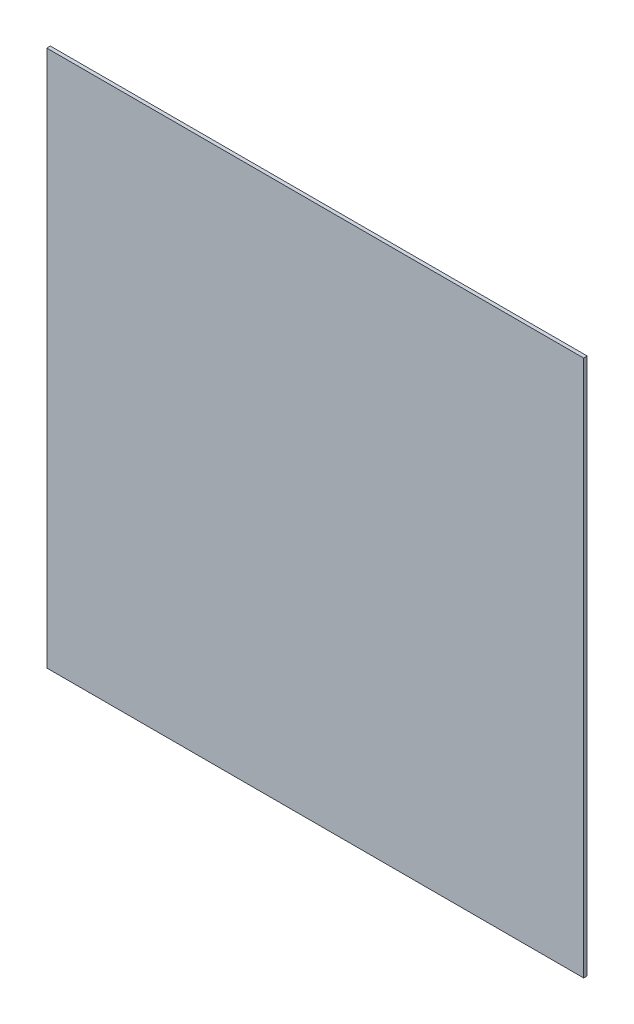
ISO-10303-21;
HEADER;
FILE_DESCRIPTION(('STEP AP214'),'2;1');
FILE_NAME('part.step','',(''),(''),'','','');
FILE_SCHEMA(('AUTOMOTIVE_DESIGN { 1 0 10303 214 1 1 1 1 }'));
ENDSEC;
DATA;
#1=APPLICATION_CONTEXT('core data for automotive mechanical design processes');
#2=APPLICATION_PROTOCOL_DEFINITION('international standard','automotive_design',2000,#1);
#3=PRODUCT_CONTEXT('',#1,'mechanical');
#4=PRODUCT('Part','Part','',(#3));
#5=PRODUCT_RELATED_PRODUCT_CATEGORY('part','',(#4));
#6=PRODUCT_DEFINITION_FORMATION('','',#4);
#7=PRODUCT_DEFINITION_CONTEXT('part definition',#1,'design');
#8=PRODUCT_DEFINITION('design','',#6,#7);
#9=PRODUCT_DEFINITION_SHAPE('','',#8);
#10=(LENGTH_UNIT() NAMED_UNIT(*) SI_UNIT(.MILLI.,.METRE.));
#11=(NAMED_UNIT(*) PLANE_ANGLE_UNIT() SI_UNIT($,.RADIAN.));
#12=(NAMED_UNIT(*) SI_UNIT($,.STERADIAN.) SOLID_ANGLE_UNIT());
#13=UNCERTAINTY_MEASURE_WITH_UNIT(LENGTH_MEASURE(1.E-05),#10,'distance_accuracy_value','');
#14=(GEOMETRIC_REPRESENTATION_CONTEXT(3) GLOBAL_UNCERTAINTY_ASSIGNED_CONTEXT((#13)) GLOBAL_UNIT_ASSIGNED_CONTEXT((#10,
#11,#12)) REPRESENTATION_CONTEXT('',''));
#15=CARTESIAN_POINT('',(0.,0.,0.));
#16=DIRECTION('',(0.,0.,1.));
#17=DIRECTION('',(1.,0.,0.));
#18=AXIS2_PLACEMENT_3D('',#15,#16,#17);
#19=CARTESIAN_POINT('',(0.,0.,3.));
#20=DIRECTION('',(1.,0.,0.));
#21=DIRECTION('',(0.,0.,-1.));
#22=AXIS2_PLACEMENT_3D('',#19,#20,#21);
#23=PLANE('',#22);
#24=DIRECTION('',(0.,-1.,0.));
#25=VECTOR('',#24,1.);
#26=CARTESIAN_POINT('',(0.,0.,0.));
#27=LINE('',#26,#25);
#28=CARTESIAN_POINT('',(0.,450.,0.));
#29=VERTEX_POINT('',#28);
#30=CARTESIAN_POINT('',(0.,0.,0.));
#31=VERTEX_POINT('',#30);
#32=EDGE_CURVE('E111',#29,#31,#27,.T.);
#33=ORIENTED_EDGE('',*,*,#32,.T.);
#34=DIRECTION('',(0.,0.,-1.));
#35=VECTOR('',#34,1.);
#36=CARTESIAN_POINT('',(0.,0.,3.));
#37=LINE('',#36,#35);
#38=CARTESIAN_POINT('',(0.,0.,3.));
#39=VERTEX_POINT('',#38);
#40=EDGE_CURVE('E11',#39,#31,#37,.T.);
#41=ORIENTED_EDGE('',*,*,#40,.F.);
#42=DIRECTION('',(0.,-1.,0.));
#43=VECTOR('',#42,1.);
#44=CARTESIAN_POINT('',(0.,0.,3.));
#45=LINE('',#44,#43);
#46=CARTESIAN_POINT('',(0.,450.,3.));
#47=VERTEX_POINT('',#46);
#48=EDGE_CURVE('E95',#47,#39,#45,.T.);
#49=ORIENTED_EDGE('',*,*,#48,.F.);
#50=DIRECTION('',(0.,0.,-1.));
#51=VECTOR('',#50,1.);
#52=CARTESIAN_POINT('',(0.,450.,3.));
#53=LINE('',#52,#51);
#54=EDGE_CURVE('E107',#47,#29,#53,.T.);
#55=ORIENTED_EDGE('',*,*,#54,.T.);
#56=EDGE_LOOP('',(#33,#41,#49,#55));
#57=FACE_BOUND('',#56,.T.);
#58=ADVANCED_FACE('F43',(#57),#23,.F.);
#59=CARTESIAN_POINT('',(0.,0.,3.));
#60=DIRECTION('',(0.,1.,0.));
#61=DIRECTION('',(0.,0.,1.));
#62=AXIS2_PLACEMENT_3D('',#59,#60,#61);
#63=PLANE('',#62);
#64=DIRECTION('',(1.,0.,0.));
#65=VECTOR('',#64,1.);
#66=CARTESIAN_POINT('',(0.,0.,0.));
#67=LINE('',#66,#65);
#68=CARTESIAN_POINT('',(450.,0.,0.));
#69=VERTEX_POINT('',#68);
#70=EDGE_CURVE('E100',#31,#69,#67,.T.);
#71=ORIENTED_EDGE('',*,*,#70,.T.);
#72=DIRECTION('',(0.,0.,-1.));
#73=VECTOR('',#72,1.);
#74=CARTESIAN_POINT('',(450.,0.,3.));
#75=LINE('',#74,#73);
#76=CARTESIAN_POINT('',(450.,0.,3.));
#77=VERTEX_POINT('',#76);
#78=EDGE_CURVE('E52',#77,#69,#75,.T.);
#79=ORIENTED_EDGE('',*,*,#78,.F.);
#80=DIRECTION('',(1.,0.,0.));
#81=VECTOR('',#80,1.);
#82=CARTESIAN_POINT('',(0.,0.,3.));
#83=LINE('',#82,#81);
#84=EDGE_CURVE('E90',#39,#77,#83,.T.);
#85=ORIENTED_EDGE('',*,*,#84,.F.);
#86=ORIENTED_EDGE('',*,*,#40,.T.);
#87=EDGE_LOOP('',(#71,#79,#85,#86));
#88=FACE_BOUND('',#87,.T.);
#89=ADVANCED_FACE('F99',(#88),#63,.F.);
#90=CARTESIAN_POINT('',(450.,0.,3.));
#91=DIRECTION('',(-1.,0.,0.));
#92=DIRECTION('',(0.,0.,1.));
#93=AXIS2_PLACEMENT_3D('',#90,#91,#92);
#94=PLANE('',#93);
#95=DIRECTION('',(0.,1.,0.));
#96=VECTOR('',#95,1.);
#97=CARTESIAN_POINT('',(450.,0.,0.));
#98=LINE('',#97,#96);
#99=CARTESIAN_POINT('',(450.,450.,0.));
#100=VERTEX_POINT('',#99);
#101=EDGE_CURVE('E77',#69,#100,#98,.T.);
#102=ORIENTED_EDGE('',*,*,#101,.T.);
#103=DIRECTION('',(0.,0.,-1.));
#104=VECTOR('',#103,1.);
#105=CARTESIAN_POINT('',(450.,450.,3.));
#106=LINE('',#105,#104);
#107=CARTESIAN_POINT('',(450.,450.,3.));
#108=VERTEX_POINT('',#107);
#109=EDGE_CURVE('E102',#108,#100,#106,.T.);
#110=ORIENTED_EDGE('',*,*,#109,.F.);
#111=DIRECTION('',(0.,1.,0.));
#112=VECTOR('',#111,1.);
#113=CARTESIAN_POINT('',(450.,0.,3.));
#114=LINE('',#113,#112);
#115=EDGE_CURVE('E93',#77,#108,#114,.T.);
#116=ORIENTED_EDGE('',*,*,#115,.F.);
#117=ORIENTED_EDGE('',*,*,#78,.T.);
#118=EDGE_LOOP('',(#102,#110,#116,#117));
#119=FACE_BOUND('',#118,.T.);
#120=ADVANCED_FACE('F103',(#119),#94,.F.);
#121=CARTESIAN_POINT('',(0.,450.,3.));
#122=DIRECTION('',(0.,-1.,0.));
#123=DIRECTION('',(0.,0.,-1.));
#124=AXIS2_PLACEMENT_3D('',#121,#122,#123);
#125=PLANE('',#124);
#126=DIRECTION('',(-1.,0.,0.));
#127=VECTOR('',#126,1.);
#128=CARTESIAN_POINT('',(0.,450.,0.));
#129=LINE('',#128,#127);
#130=EDGE_CURVE('E83',#100,#29,#129,.T.);
#131=ORIENTED_EDGE('',*,*,#130,.T.);
#132=ORIENTED_EDGE('',*,*,#54,.F.);
#133=DIRECTION('',(-1.,0.,0.));
#134=VECTOR('',#133,1.);
#135=CARTESIAN_POINT('',(0.,450.,3.));
#136=LINE('',#135,#134);
#137=EDGE_CURVE('E60',#108,#47,#136,.T.);
#138=ORIENTED_EDGE('',*,*,#137,.F.);
#139=ORIENTED_EDGE('',*,*,#109,.T.);
#140=EDGE_LOOP('',(#131,#132,#138,#139));
#141=FACE_BOUND('',#140,.T.);
#142=ADVANCED_FACE('F124',(#141),#125,.F.);
#143=CARTESIAN_POINT('',(0.,0.,3.));
#144=DIRECTION('',(0.,0.,-1.));
#145=DIRECTION('',(-1.,0.,0.));
#146=AXIS2_PLACEMENT_3D('',#143,#144,#145);
#147=PLANE('',#146);
#148=ORIENTED_EDGE('',*,*,#48,.T.);
#149=ORIENTED_EDGE('',*,*,#84,.T.);
#150=ORIENTED_EDGE('',*,*,#115,.T.);
#151=ORIENTED_EDGE('',*,*,#137,.T.);
#152=EDGE_LOOP('',(#148,#149,#150,#151));
#153=FACE_BOUND('',#152,.T.);
#154=ADVANCED_FACE('F91',(#153),#147,.F.);
#155=CARTESIAN_POINT('',(0.,0.,0.));
#156=DIRECTION('',(0.,0.,-1.));
#157=DIRECTION('',(-1.,0.,0.));
#158=AXIS2_PLACEMENT_3D('',#155,#156,#157);
#159=PLANE('',#158);
#160=ORIENTED_EDGE('',*,*,#32,.F.);
#161=ORIENTED_EDGE('',*,*,#130,.F.);
#162=ORIENTED_EDGE('',*,*,#101,.F.);
#163=ORIENTED_EDGE('',*,*,#70,.F.);
#164=EDGE_LOOP('',(#160,#161,#162,#163));
#165=FACE_BOUND('',#164,.T.);
#166=ADVANCED_FACE('F127',(#165),#159,.T.);
#167=CLOSED_SHELL('',(#58,#89,#120,#142,#154,#166));
#168=MANIFOLD_SOLID_BREP('B2',#167);
#169=ADVANCED_BREP_SHAPE_REPRESENTATION('',(#18,#168),#14);
#170=SHAPE_DEFINITION_REPRESENTATION(#9,#169);
ENDSEC;
END-ISO-10303-21;
